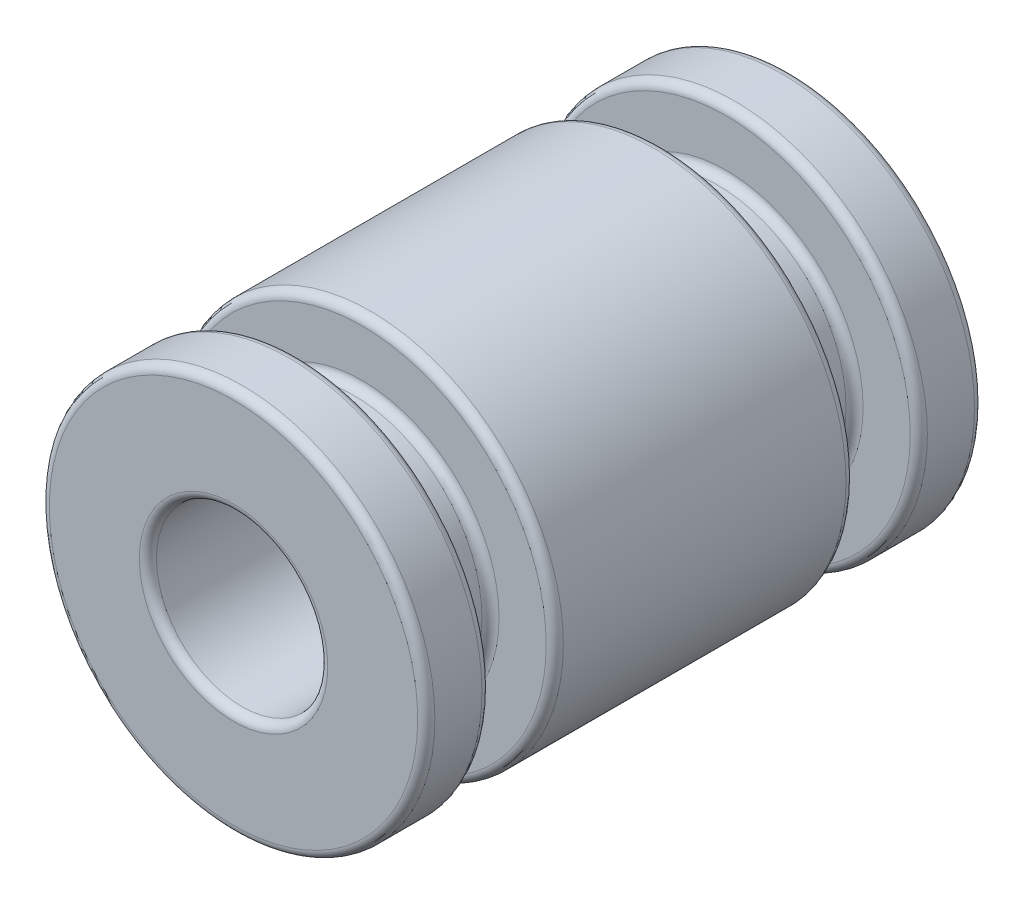
ISO-10303-21;
HEADER;
FILE_DESCRIPTION(('STEP AP214'),'2;1');
FILE_NAME('part.step','',(''),(''),'','','');
FILE_SCHEMA(('AUTOMOTIVE_DESIGN { 1 0 10303 214 1 1 1 1 }'));
ENDSEC;
DATA;
#1=APPLICATION_CONTEXT('core data for automotive mechanical design processes');
#2=APPLICATION_PROTOCOL_DEFINITION('international standard','automotive_design',2000,#1);
#3=PRODUCT_CONTEXT('',#1,'mechanical');
#4=PRODUCT('Part','Part','',(#3));
#5=PRODUCT_RELATED_PRODUCT_CATEGORY('part','',(#4));
#6=PRODUCT_DEFINITION_FORMATION('','',#4);
#7=PRODUCT_DEFINITION_CONTEXT('part definition',#1,'design');
#8=PRODUCT_DEFINITION('design','',#6,#7);
#9=PRODUCT_DEFINITION_SHAPE('','',#8);
#10=(LENGTH_UNIT() NAMED_UNIT(*) SI_UNIT(.MILLI.,.METRE.));
#11=(NAMED_UNIT(*) PLANE_ANGLE_UNIT() SI_UNIT($,.RADIAN.));
#12=(NAMED_UNIT(*) SI_UNIT($,.STERADIAN.) SOLID_ANGLE_UNIT());
#13=UNCERTAINTY_MEASURE_WITH_UNIT(LENGTH_MEASURE(1.E-05),#10,'distance_accuracy_value','');
#14=(GEOMETRIC_REPRESENTATION_CONTEXT(3) GLOBAL_UNCERTAINTY_ASSIGNED_CONTEXT((#13)) GLOBAL_UNIT_ASSIGNED_CONTEXT((#10,
#11,#12)) REPRESENTATION_CONTEXT('',''));
#15=CARTESIAN_POINT('',(0.,0.,0.));
#16=DIRECTION('',(0.,0.,1.));
#17=DIRECTION('',(1.,0.,0.));
#18=AXIS2_PLACEMENT_3D('',#15,#16,#17);
#19=CARTESIAN_POINT('',(0.,0.,-6.3));
#20=DIRECTION('',(0.,0.,1.));
#21=DIRECTION('',(1.,0.,0.));
#22=AXIS2_PLACEMENT_3D('',#19,#20,#21);
#23=TOROIDAL_SURFACE('',#22,2.2,0.2);
#24=CARTESIAN_POINT('',(0.,0.,-6.3));
#25=DIRECTION('',(0.,0.,1.));
#26=DIRECTION('',(1.,0.,0.));
#27=AXIS2_PLACEMENT_3D('',#24,#25,#26);
#28=CIRCLE('',#27,2.);
#29=CARTESIAN_POINT('',(2.,0.,-6.3));
#30=VERTEX_POINT('',#29);
#31=EDGE_CURVE('E10',#30,#30,#28,.T.);
#32=ORIENTED_EDGE('',*,*,#31,.T.);
#33=EDGE_LOOP('',(#32));
#34=FACE_BOUND('',#33,.T.);
#35=CARTESIAN_POINT('',(0.,0.,-6.5));
#36=DIRECTION('',(0.,0.,1.));
#37=DIRECTION('',(1.,0.,0.));
#38=AXIS2_PLACEMENT_3D('',#35,#36,#37);
#39=CIRCLE('',#38,2.2);
#40=CARTESIAN_POINT('',(2.2,0.,-6.5));
#41=VERTEX_POINT('',#40);
#42=EDGE_CURVE('E113',#41,#41,#39,.T.);
#43=ORIENTED_EDGE('',*,*,#42,.F.);
#44=EDGE_LOOP('',(#43));
#45=FACE_BOUND('',#44,.T.);
#46=ADVANCED_FACE('F37',(#34,#45),#23,.T.);
#47=CARTESIAN_POINT('',(0.,0.,-6.50304705638436));
#48=DIRECTION('',(0.,0.,1.));
#49=DIRECTION('',(1.,0.,0.));
#50=AXIS2_PLACEMENT_3D('',#47,#48,#49);
#51=CYLINDRICAL_SURFACE('',#50,2.);
#52=CARTESIAN_POINT('',(0.,0.,6.3));
#53=DIRECTION('',(0.,0.,1.));
#54=DIRECTION('',(1.,0.,0.));
#55=AXIS2_PLACEMENT_3D('',#52,#53,#54);
#56=CIRCLE('',#55,2.);
#57=CARTESIAN_POINT('',(2.,0.,6.3));
#58=VERTEX_POINT('',#57);
#59=EDGE_CURVE('E43',#58,#58,#56,.T.);
#60=ORIENTED_EDGE('',*,*,#59,.T.);
#61=EDGE_LOOP('',(#60));
#62=FACE_BOUND('',#61,.T.);
#63=ORIENTED_EDGE('',*,*,#31,.F.);
#64=EDGE_LOOP('',(#63));
#65=FACE_BOUND('',#64,.T.);
#66=ADVANCED_FACE('F121',(#62,#65),#51,.F.);
#67=CARTESIAN_POINT('',(0.,0.,6.3));
#68=DIRECTION('',(0.,0.,1.));
#69=DIRECTION('',(1.,0.,0.));
#70=AXIS2_PLACEMENT_3D('',#67,#68,#69);
#71=TOROIDAL_SURFACE('',#70,2.2,0.2);
#72=CARTESIAN_POINT('',(0.,0.,6.5));
#73=DIRECTION('',(0.,0.,1.));
#74=DIRECTION('',(1.,0.,0.));
#75=AXIS2_PLACEMENT_3D('',#72,#73,#74);
#76=CIRCLE('',#75,2.2);
#77=CARTESIAN_POINT('',(2.2,0.,6.5));
#78=VERTEX_POINT('',#77);
#79=EDGE_CURVE('E47',#78,#78,#76,.T.);
#80=ORIENTED_EDGE('',*,*,#79,.T.);
#81=EDGE_LOOP('',(#80));
#82=FACE_BOUND('',#81,.T.);
#83=ORIENTED_EDGE('',*,*,#59,.F.);
#84=EDGE_LOOP('',(#83));
#85=FACE_BOUND('',#84,.T.);
#86=ADVANCED_FACE('F125',(#82,#85),#71,.T.);
#87=CARTESIAN_POINT('',(2.2,0.,6.5));
#88=DIRECTION('',(0.,0.,1.));
#89=DIRECTION('',(1.,0.,0.));
#90=AXIS2_PLACEMENT_3D('',#87,#88,#89);
#91=PLANE('',#90);
#92=CARTESIAN_POINT('',(0.,0.,6.5));
#93=DIRECTION('',(0.,0.,1.));
#94=DIRECTION('',(1.,0.,0.));
#95=AXIS2_PLACEMENT_3D('',#92,#93,#94);
#96=CIRCLE('',#95,4.3);
#97=CARTESIAN_POINT('',(4.3,0.,6.5));
#98=VERTEX_POINT('',#97);
#99=EDGE_CURVE('E51',#98,#98,#96,.T.);
#100=ORIENTED_EDGE('',*,*,#99,.T.);
#101=EDGE_LOOP('',(#100));
#102=FACE_BOUND('',#101,.T.);
#103=ORIENTED_EDGE('',*,*,#79,.F.);
#104=EDGE_LOOP('',(#103));
#105=FACE_BOUND('',#104,.T.);
#106=ADVANCED_FACE('F129',(#102,#105),#91,.T.);
#107=CARTESIAN_POINT('',(0.,0.,6.3));
#108=DIRECTION('',(0.,0.,1.));
#109=DIRECTION('',(1.,0.,0.));
#110=AXIS2_PLACEMENT_3D('',#107,#108,#109);
#111=TOROIDAL_SURFACE('',#110,4.3,0.200000000000001);
#112=CARTESIAN_POINT('',(0.,0.,6.3));
#113=DIRECTION('',(0.,0.,1.));
#114=DIRECTION('',(1.,0.,0.));
#115=AXIS2_PLACEMENT_3D('',#112,#113,#114);
#116=CIRCLE('',#115,4.5);
#117=CARTESIAN_POINT('',(4.5,0.,6.3));
#118=VERTEX_POINT('',#117);
#119=EDGE_CURVE('E56',#118,#118,#116,.T.);
#120=ORIENTED_EDGE('',*,*,#119,.T.);
#121=EDGE_LOOP('',(#120));
#122=FACE_BOUND('',#121,.T.);
#123=ORIENTED_EDGE('',*,*,#99,.F.);
#124=EDGE_LOOP('',(#123));
#125=FACE_BOUND('',#124,.T.);
#126=ADVANCED_FACE('F136',(#122,#125),#111,.T.);
#127=CARTESIAN_POINT('',(0.,0.,-6.50304705638436));
#128=DIRECTION('',(0.,0.,1.));
#129=DIRECTION('',(1.,0.,0.));
#130=AXIS2_PLACEMENT_3D('',#127,#128,#129);
#131=CYLINDRICAL_SURFACE('',#130,4.5);
#132=CARTESIAN_POINT('',(0.,0.,5.2));
#133=DIRECTION('',(0.,0.,1.));
#134=DIRECTION('',(1.,0.,0.));
#135=AXIS2_PLACEMENT_3D('',#132,#133,#134);
#136=CIRCLE('',#135,4.5);
#137=CARTESIAN_POINT('',(4.5,0.,5.2));
#138=VERTEX_POINT('',#137);
#139=EDGE_CURVE('E59',#138,#138,#136,.T.);
#140=ORIENTED_EDGE('',*,*,#139,.T.);
#141=EDGE_LOOP('',(#140));
#142=FACE_BOUND('',#141,.T.);
#143=ORIENTED_EDGE('',*,*,#119,.F.);
#144=EDGE_LOOP('',(#143));
#145=FACE_BOUND('',#144,.T.);
#146=ADVANCED_FACE('F140',(#142,#145),#131,.T.);
#147=CARTESIAN_POINT('',(0.,0.,5.2));
#148=DIRECTION('',(0.,0.,1.));
#149=DIRECTION('',(1.,0.,0.));
#150=AXIS2_PLACEMENT_3D('',#147,#148,#149);
#151=TOROIDAL_SURFACE('',#150,4.3,0.2);
#152=CARTESIAN_POINT('',(0.,0.,5.));
#153=DIRECTION('',(0.,0.,1.));
#154=DIRECTION('',(1.,0.,0.));
#155=AXIS2_PLACEMENT_3D('',#152,#153,#154);
#156=CIRCLE('',#155,4.3);
#157=CARTESIAN_POINT('',(4.3,0.,5.));
#158=VERTEX_POINT('',#157);
#159=EDGE_CURVE('E62',#158,#158,#156,.T.);
#160=ORIENTED_EDGE('',*,*,#159,.T.);
#161=EDGE_LOOP('',(#160));
#162=FACE_BOUND('',#161,.T.);
#163=ORIENTED_EDGE('',*,*,#139,.F.);
#164=EDGE_LOOP('',(#163));
#165=FACE_BOUND('',#164,.T.);
#166=ADVANCED_FACE('F144',(#162,#165),#151,.T.);
#167=CARTESIAN_POINT('',(4.3,0.,5.));
#168=DIRECTION('',(0.,0.,-1.));
#169=DIRECTION('',(-1.,0.,0.));
#170=AXIS2_PLACEMENT_3D('',#167,#168,#169);
#171=PLANE('',#170);
#172=CARTESIAN_POINT('',(0.,0.,5.));
#173=DIRECTION('',(0.,0.,1.));
#174=DIRECTION('',(1.,0.,0.));
#175=AXIS2_PLACEMENT_3D('',#172,#173,#174);
#176=CIRCLE('',#175,3.2);
#177=CARTESIAN_POINT('',(3.2,0.,5.));
#178=VERTEX_POINT('',#177);
#179=EDGE_CURVE('E65',#178,#178,#176,.T.);
#180=ORIENTED_EDGE('',*,*,#179,.T.);
#181=EDGE_LOOP('',(#180));
#182=FACE_BOUND('',#181,.T.);
#183=ORIENTED_EDGE('',*,*,#159,.F.);
#184=EDGE_LOOP('',(#183));
#185=FACE_BOUND('',#184,.T.);
#186=ADVANCED_FACE('F148',(#182,#185),#171,.T.);
#187=CARTESIAN_POINT('',(0.,0.,4.8));
#188=DIRECTION('',(0.,0.,1.));
#189=DIRECTION('',(1.,0.,0.));
#190=AXIS2_PLACEMENT_3D('',#187,#188,#189);
#191=TOROIDAL_SURFACE('',#190,3.2,0.2);
#192=CARTESIAN_POINT('',(0.,0.,4.8));
#193=DIRECTION('',(0.,0.,1.));
#194=DIRECTION('',(1.,0.,0.));
#195=AXIS2_PLACEMENT_3D('',#192,#193,#194);
#196=CIRCLE('',#195,3.);
#197=CARTESIAN_POINT('',(3.,0.,4.8));
#198=VERTEX_POINT('',#197);
#199=EDGE_CURVE('E68',#198,#198,#196,.T.);
#200=ORIENTED_EDGE('',*,*,#199,.T.);
#201=EDGE_LOOP('',(#200));
#202=FACE_BOUND('',#201,.T.);
#203=ORIENTED_EDGE('',*,*,#179,.F.);
#204=EDGE_LOOP('',(#203));
#205=FACE_BOUND('',#204,.T.);
#206=ADVANCED_FACE('F152',(#202,#205),#191,.F.);
#207=CARTESIAN_POINT('',(0.,0.,-6.50304705638436));
#208=DIRECTION('',(0.,0.,1.));
#209=DIRECTION('',(1.,0.,0.));
#210=AXIS2_PLACEMENT_3D('',#207,#208,#209);
#211=CYLINDRICAL_SURFACE('',#210,3.);
#212=CARTESIAN_POINT('',(0.,0.,3.7));
#213=DIRECTION('',(0.,0.,1.));
#214=DIRECTION('',(1.,0.,0.));
#215=AXIS2_PLACEMENT_3D('',#212,#213,#214);
#216=CIRCLE('',#215,3.);
#217=CARTESIAN_POINT('',(3.,0.,3.7));
#218=VERTEX_POINT('',#217);
#219=EDGE_CURVE('E71',#218,#218,#216,.T.);
#220=ORIENTED_EDGE('',*,*,#219,.T.);
#221=EDGE_LOOP('',(#220));
#222=FACE_BOUND('',#221,.T.);
#223=ORIENTED_EDGE('',*,*,#199,.F.);
#224=EDGE_LOOP('',(#223));
#225=FACE_BOUND('',#224,.T.);
#226=ADVANCED_FACE('F156',(#222,#225),#211,.T.);
#227=CARTESIAN_POINT('',(0.,0.,3.7));
#228=DIRECTION('',(0.,0.,1.));
#229=DIRECTION('',(1.,0.,0.));
#230=AXIS2_PLACEMENT_3D('',#227,#228,#229);
#231=TOROIDAL_SURFACE('',#230,3.2,0.2);
#232=CARTESIAN_POINT('',(0.,0.,3.5));
#233=DIRECTION('',(0.,0.,1.));
#234=DIRECTION('',(1.,0.,0.));
#235=AXIS2_PLACEMENT_3D('',#232,#233,#234);
#236=CIRCLE('',#235,3.2);
#237=CARTESIAN_POINT('',(3.2,0.,3.5));
#238=VERTEX_POINT('',#237);
#239=EDGE_CURVE('E74',#238,#238,#236,.T.);
#240=ORIENTED_EDGE('',*,*,#239,.T.);
#241=EDGE_LOOP('',(#240));
#242=FACE_BOUND('',#241,.T.);
#243=ORIENTED_EDGE('',*,*,#219,.F.);
#244=EDGE_LOOP('',(#243));
#245=FACE_BOUND('',#244,.T.);
#246=ADVANCED_FACE('F160',(#242,#245),#231,.F.);
#247=CARTESIAN_POINT('',(3.2,0.,3.5));
#248=DIRECTION('',(0.,0.,1.));
#249=DIRECTION('',(1.,0.,0.));
#250=AXIS2_PLACEMENT_3D('',#247,#248,#249);
#251=PLANE('',#250);
#252=CARTESIAN_POINT('',(0.,0.,3.5));
#253=DIRECTION('',(0.,0.,1.));
#254=DIRECTION('',(1.,0.,0.));
#255=AXIS2_PLACEMENT_3D('',#252,#253,#254);
#256=CIRCLE('',#255,4.3);
#257=CARTESIAN_POINT('',(4.3,0.,3.5));
#258=VERTEX_POINT('',#257);
#259=EDGE_CURVE('E77',#258,#258,#256,.T.);
#260=ORIENTED_EDGE('',*,*,#259,.T.);
#261=EDGE_LOOP('',(#260));
#262=FACE_BOUND('',#261,.T.);
#263=ORIENTED_EDGE('',*,*,#239,.F.);
#264=EDGE_LOOP('',(#263));
#265=FACE_BOUND('',#264,.T.);
#266=ADVANCED_FACE('F164',(#262,#265),#251,.T.);
#267=CARTESIAN_POINT('',(0.,0.,3.3));
#268=DIRECTION('',(0.,0.,1.));
#269=DIRECTION('',(1.,0.,0.));
#270=AXIS2_PLACEMENT_3D('',#267,#268,#269);
#271=TOROIDAL_SURFACE('',#270,4.3,0.2);
#272=CARTESIAN_POINT('',(0.,0.,3.3));
#273=DIRECTION('',(0.,0.,1.));
#274=DIRECTION('',(1.,0.,0.));
#275=AXIS2_PLACEMENT_3D('',#272,#273,#274);
#276=CIRCLE('',#275,4.5);
#277=CARTESIAN_POINT('',(4.5,0.,3.3));
#278=VERTEX_POINT('',#277);
#279=EDGE_CURVE('E80',#278,#278,#276,.T.);
#280=ORIENTED_EDGE('',*,*,#279,.T.);
#281=EDGE_LOOP('',(#280));
#282=FACE_BOUND('',#281,.T.);
#283=ORIENTED_EDGE('',*,*,#259,.F.);
#284=EDGE_LOOP('',(#283));
#285=FACE_BOUND('',#284,.T.);
#286=ADVANCED_FACE('F168',(#282,#285),#271,.T.);
#287=CARTESIAN_POINT('',(0.,0.,-6.50304705638436));
#288=DIRECTION('',(0.,0.,1.));
#289=DIRECTION('',(1.,0.,0.));
#290=AXIS2_PLACEMENT_3D('',#287,#288,#289);
#291=CYLINDRICAL_SURFACE('',#290,4.5);
#292=CARTESIAN_POINT('',(0.,0.,-3.3));
#293=DIRECTION('',(0.,0.,1.));
#294=DIRECTION('',(1.,0.,0.));
#295=AXIS2_PLACEMENT_3D('',#292,#293,#294);
#296=CIRCLE('',#295,4.5);
#297=CARTESIAN_POINT('',(4.5,0.,-3.3));
#298=VERTEX_POINT('',#297);
#299=EDGE_CURVE('E83',#298,#298,#296,.T.);
#300=ORIENTED_EDGE('',*,*,#299,.T.);
#301=EDGE_LOOP('',(#300));
#302=FACE_BOUND('',#301,.T.);
#303=ORIENTED_EDGE('',*,*,#279,.F.);
#304=EDGE_LOOP('',(#303));
#305=FACE_BOUND('',#304,.T.);
#306=ADVANCED_FACE('F172',(#302,#305),#291,.T.);
#307=CARTESIAN_POINT('',(0.,0.,-3.3));
#308=DIRECTION('',(0.,0.,1.));
#309=DIRECTION('',(1.,0.,0.));
#310=AXIS2_PLACEMENT_3D('',#307,#308,#309);
#311=TOROIDAL_SURFACE('',#310,4.3,0.2);
#312=CARTESIAN_POINT('',(0.,0.,-3.5));
#313=DIRECTION('',(0.,0.,1.));
#314=DIRECTION('',(1.,0.,0.));
#315=AXIS2_PLACEMENT_3D('',#312,#313,#314);
#316=CIRCLE('',#315,4.3);
#317=CARTESIAN_POINT('',(4.3,0.,-3.5));
#318=VERTEX_POINT('',#317);
#319=EDGE_CURVE('E86',#318,#318,#316,.T.);
#320=ORIENTED_EDGE('',*,*,#319,.T.);
#321=EDGE_LOOP('',(#320));
#322=FACE_BOUND('',#321,.T.);
#323=ORIENTED_EDGE('',*,*,#299,.F.);
#324=EDGE_LOOP('',(#323));
#325=FACE_BOUND('',#324,.T.);
#326=ADVANCED_FACE('F176',(#322,#325),#311,.T.);
#327=CARTESIAN_POINT('',(4.3,0.,-3.5));
#328=DIRECTION('',(0.,0.,-1.));
#329=DIRECTION('',(-1.,0.,0.));
#330=AXIS2_PLACEMENT_3D('',#327,#328,#329);
#331=PLANE('',#330);
#332=CARTESIAN_POINT('',(0.,0.,-3.5));
#333=DIRECTION('',(0.,0.,1.));
#334=DIRECTION('',(1.,0.,0.));
#335=AXIS2_PLACEMENT_3D('',#332,#333,#334);
#336=CIRCLE('',#335,3.2);
#337=CARTESIAN_POINT('',(3.2,0.,-3.5));
#338=VERTEX_POINT('',#337);
#339=EDGE_CURVE('E89',#338,#338,#336,.T.);
#340=ORIENTED_EDGE('',*,*,#339,.T.);
#341=EDGE_LOOP('',(#340));
#342=FACE_BOUND('',#341,.T.);
#343=ORIENTED_EDGE('',*,*,#319,.F.);
#344=EDGE_LOOP('',(#343));
#345=FACE_BOUND('',#344,.T.);
#346=ADVANCED_FACE('F180',(#342,#345),#331,.T.);
#347=CARTESIAN_POINT('',(0.,0.,-3.7));
#348=DIRECTION('',(0.,0.,1.));
#349=DIRECTION('',(1.,0.,0.));
#350=AXIS2_PLACEMENT_3D('',#347,#348,#349);
#351=TOROIDAL_SURFACE('',#350,3.2,0.2);
#352=CARTESIAN_POINT('',(0.,0.,-3.7));
#353=DIRECTION('',(0.,0.,1.));
#354=DIRECTION('',(1.,0.,0.));
#355=AXIS2_PLACEMENT_3D('',#352,#353,#354);
#356=CIRCLE('',#355,3.);
#357=CARTESIAN_POINT('',(3.,0.,-3.7));
#358=VERTEX_POINT('',#357);
#359=EDGE_CURVE('E92',#358,#358,#356,.T.);
#360=ORIENTED_EDGE('',*,*,#359,.T.);
#361=EDGE_LOOP('',(#360));
#362=FACE_BOUND('',#361,.T.);
#363=ORIENTED_EDGE('',*,*,#339,.F.);
#364=EDGE_LOOP('',(#363));
#365=FACE_BOUND('',#364,.T.);
#366=ADVANCED_FACE('F184',(#362,#365),#351,.F.);
#367=CARTESIAN_POINT('',(0.,0.,-6.50304705638436));
#368=DIRECTION('',(0.,0.,1.));
#369=DIRECTION('',(1.,0.,0.));
#370=AXIS2_PLACEMENT_3D('',#367,#368,#369);
#371=CYLINDRICAL_SURFACE('',#370,3.);
#372=CARTESIAN_POINT('',(0.,0.,-4.8));
#373=DIRECTION('',(0.,0.,1.));
#374=DIRECTION('',(1.,0.,0.));
#375=AXIS2_PLACEMENT_3D('',#372,#373,#374);
#376=CIRCLE('',#375,3.);
#377=CARTESIAN_POINT('',(3.,0.,-4.8));
#378=VERTEX_POINT('',#377);
#379=EDGE_CURVE('E95',#378,#378,#376,.T.);
#380=ORIENTED_EDGE('',*,*,#379,.T.);
#381=EDGE_LOOP('',(#380));
#382=FACE_BOUND('',#381,.T.);
#383=ORIENTED_EDGE('',*,*,#359,.F.);
#384=EDGE_LOOP('',(#383));
#385=FACE_BOUND('',#384,.T.);
#386=ADVANCED_FACE('F188',(#382,#385),#371,.T.);
#387=CARTESIAN_POINT('',(0.,0.,-4.8));
#388=DIRECTION('',(0.,0.,1.));
#389=DIRECTION('',(1.,0.,0.));
#390=AXIS2_PLACEMENT_3D('',#387,#388,#389);
#391=TOROIDAL_SURFACE('',#390,3.2,0.2);
#392=CARTESIAN_POINT('',(0.,0.,-5.));
#393=DIRECTION('',(0.,0.,1.));
#394=DIRECTION('',(1.,0.,0.));
#395=AXIS2_PLACEMENT_3D('',#392,#393,#394);
#396=CIRCLE('',#395,3.2);
#397=CARTESIAN_POINT('',(3.2,0.,-5.));
#398=VERTEX_POINT('',#397);
#399=EDGE_CURVE('E98',#398,#398,#396,.T.);
#400=ORIENTED_EDGE('',*,*,#399,.T.);
#401=EDGE_LOOP('',(#400));
#402=FACE_BOUND('',#401,.T.);
#403=ORIENTED_EDGE('',*,*,#379,.F.);
#404=EDGE_LOOP('',(#403));
#405=FACE_BOUND('',#404,.T.);
#406=ADVANCED_FACE('F192',(#402,#405),#391,.F.);
#407=CARTESIAN_POINT('',(3.2,0.,-5.));
#408=DIRECTION('',(0.,0.,1.));
#409=DIRECTION('',(1.,0.,0.));
#410=AXIS2_PLACEMENT_3D('',#407,#408,#409);
#411=PLANE('',#410);
#412=CARTESIAN_POINT('',(0.,0.,-5.));
#413=DIRECTION('',(0.,0.,1.));
#414=DIRECTION('',(1.,0.,0.));
#415=AXIS2_PLACEMENT_3D('',#412,#413,#414);
#416=CIRCLE('',#415,4.3);
#417=CARTESIAN_POINT('',(4.3,0.,-5.));
#418=VERTEX_POINT('',#417);
#419=EDGE_CURVE('E101',#418,#418,#416,.T.);
#420=ORIENTED_EDGE('',*,*,#419,.T.);
#421=EDGE_LOOP('',(#420));
#422=FACE_BOUND('',#421,.T.);
#423=ORIENTED_EDGE('',*,*,#399,.F.);
#424=EDGE_LOOP('',(#423));
#425=FACE_BOUND('',#424,.T.);
#426=ADVANCED_FACE('F196',(#422,#425),#411,.T.);
#427=CARTESIAN_POINT('',(0.,0.,-5.2));
#428=DIRECTION('',(0.,0.,1.));
#429=DIRECTION('',(1.,0.,0.));
#430=AXIS2_PLACEMENT_3D('',#427,#428,#429);
#431=TOROIDAL_SURFACE('',#430,4.3,0.2);
#432=CARTESIAN_POINT('',(0.,0.,-5.2));
#433=DIRECTION('',(0.,0.,1.));
#434=DIRECTION('',(1.,0.,0.));
#435=AXIS2_PLACEMENT_3D('',#432,#433,#434);
#436=CIRCLE('',#435,4.5);
#437=CARTESIAN_POINT('',(4.5,0.,-5.2));
#438=VERTEX_POINT('',#437);
#439=EDGE_CURVE('E104',#438,#438,#436,.T.);
#440=ORIENTED_EDGE('',*,*,#439,.T.);
#441=EDGE_LOOP('',(#440));
#442=FACE_BOUND('',#441,.T.);
#443=ORIENTED_EDGE('',*,*,#419,.F.);
#444=EDGE_LOOP('',(#443));
#445=FACE_BOUND('',#444,.T.);
#446=ADVANCED_FACE('F200',(#442,#445),#431,.T.);
#447=CARTESIAN_POINT('',(0.,0.,-6.50304705638436));
#448=DIRECTION('',(0.,0.,1.));
#449=DIRECTION('',(1.,0.,0.));
#450=AXIS2_PLACEMENT_3D('',#447,#448,#449);
#451=CYLINDRICAL_SURFACE('',#450,4.5);
#452=CARTESIAN_POINT('',(0.,0.,-6.3));
#453=DIRECTION('',(0.,0.,1.));
#454=DIRECTION('',(1.,0.,0.));
#455=AXIS2_PLACEMENT_3D('',#452,#453,#454);
#456=CIRCLE('',#455,4.5);
#457=CARTESIAN_POINT('',(4.5,0.,-6.3));
#458=VERTEX_POINT('',#457);
#459=EDGE_CURVE('E107',#458,#458,#456,.T.);
#460=ORIENTED_EDGE('',*,*,#459,.T.);
#461=EDGE_LOOP('',(#460));
#462=FACE_BOUND('',#461,.T.);
#463=ORIENTED_EDGE('',*,*,#439,.F.);
#464=EDGE_LOOP('',(#463));
#465=FACE_BOUND('',#464,.T.);
#466=ADVANCED_FACE('F204',(#462,#465),#451,.T.);
#467=CARTESIAN_POINT('',(0.,0.,-6.3));
#468=DIRECTION('',(0.,0.,1.));
#469=DIRECTION('',(1.,0.,0.));
#470=AXIS2_PLACEMENT_3D('',#467,#468,#469);
#471=TOROIDAL_SURFACE('',#470,4.3,0.2);
#472=CARTESIAN_POINT('',(0.,0.,-6.5));
#473=DIRECTION('',(0.,0.,1.));
#474=DIRECTION('',(1.,0.,0.));
#475=AXIS2_PLACEMENT_3D('',#472,#473,#474);
#476=CIRCLE('',#475,4.3);
#477=CARTESIAN_POINT('',(4.3,0.,-6.5));
#478=VERTEX_POINT('',#477);
#479=EDGE_CURVE('E110',#478,#478,#476,.T.);
#480=ORIENTED_EDGE('',*,*,#479,.T.);
#481=EDGE_LOOP('',(#480));
#482=FACE_BOUND('',#481,.T.);
#483=ORIENTED_EDGE('',*,*,#459,.F.);
#484=EDGE_LOOP('',(#483));
#485=FACE_BOUND('',#484,.T.);
#486=ADVANCED_FACE('F208',(#482,#485),#471,.T.);
#487=CARTESIAN_POINT('',(4.3,0.,-6.5));
#488=DIRECTION('',(0.,0.,-1.));
#489=DIRECTION('',(-1.,0.,0.));
#490=AXIS2_PLACEMENT_3D('',#487,#488,#489);
#491=PLANE('',#490);
#492=ORIENTED_EDGE('',*,*,#42,.T.);
#493=EDGE_LOOP('',(#492));
#494=FACE_BOUND('',#493,.T.);
#495=ORIENTED_EDGE('',*,*,#479,.F.);
#496=EDGE_LOOP('',(#495));
#497=FACE_BOUND('',#496,.T.);
#498=ADVANCED_FACE('F117',(#494,#497),#491,.T.);
#499=CLOSED_SHELL('',(#46,#66,#86,#106,#126,#146,#166,#186,#206,#226,#246,#266,#286,#306,#326,
#346,#366,#386,#406,#426,#446,#466,#486,#498));
#500=MANIFOLD_SOLID_BREP('B2',#499);
#501=ADVANCED_BREP_SHAPE_REPRESENTATION('',(#18,#500),#14);
#502=SHAPE_DEFINITION_REPRESENTATION(#9,#501);
ENDSEC;
END-ISO-10303-21;
